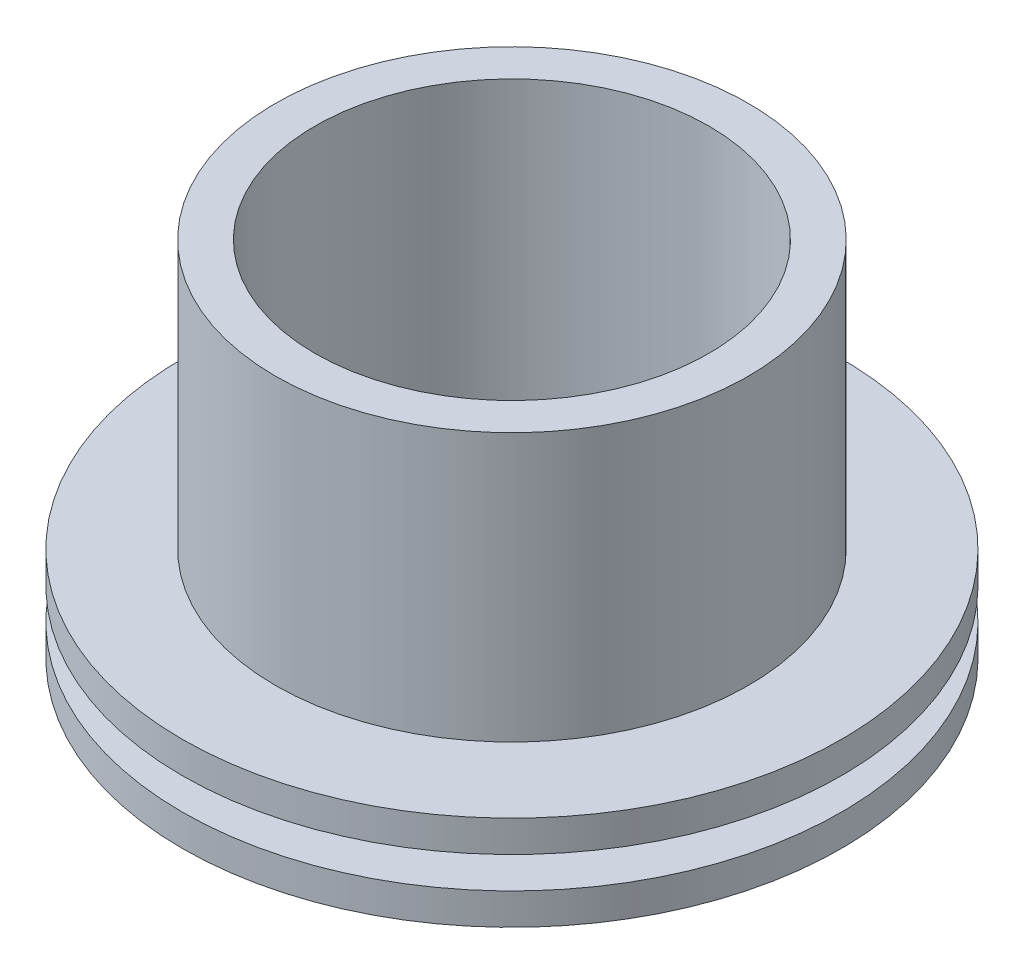
ISO-10303-21;
HEADER;
FILE_DESCRIPTION(('STEP AP214'),'2;1');
FILE_NAME('part.step','',(''),(''),'','','');
FILE_SCHEMA(('AUTOMOTIVE_DESIGN { 1 0 10303 214 1 1 1 1 }'));
ENDSEC;
DATA;
#1=APPLICATION_CONTEXT('core data for automotive mechanical design processes');
#2=APPLICATION_PROTOCOL_DEFINITION('international standard','automotive_design',2000,#1);
#3=PRODUCT_CONTEXT('',#1,'mechanical');
#4=PRODUCT('Part','Part','',(#3));
#5=PRODUCT_RELATED_PRODUCT_CATEGORY('part','',(#4));
#6=PRODUCT_DEFINITION_FORMATION('','',#4);
#7=PRODUCT_DEFINITION_CONTEXT('part definition',#1,'design');
#8=PRODUCT_DEFINITION('design','',#6,#7);
#9=PRODUCT_DEFINITION_SHAPE('','',#8);
#10=(LENGTH_UNIT() NAMED_UNIT(*) SI_UNIT(.MILLI.,.METRE.));
#11=(NAMED_UNIT(*) PLANE_ANGLE_UNIT() SI_UNIT($,.RADIAN.));
#12=(NAMED_UNIT(*) SI_UNIT($,.STERADIAN.) SOLID_ANGLE_UNIT());
#13=UNCERTAINTY_MEASURE_WITH_UNIT(LENGTH_MEASURE(1.E-05),#10,'distance_accuracy_value','');
#14=(GEOMETRIC_REPRESENTATION_CONTEXT(3) GLOBAL_UNCERTAINTY_ASSIGNED_CONTEXT((#13)) GLOBAL_UNIT_ASSIGNED_CONTEXT((#10,
#11,#12)) REPRESENTATION_CONTEXT('',''));
#15=CARTESIAN_POINT('',(0.,0.,0.));
#16=DIRECTION('',(0.,0.,1.));
#17=DIRECTION('',(1.,0.,0.));
#18=AXIS2_PLACEMENT_3D('',#15,#16,#17);
#19=CARTESIAN_POINT('',(0.,-6.,0.));
#20=DIRECTION('',(0.,1.,0.));
#21=DIRECTION('',(0.,0.,1.));
#22=AXIS2_PLACEMENT_3D('',#19,#20,#21);
#23=CYLINDRICAL_SURFACE('',#22,20.9134309357097);
#24=CARTESIAN_POINT('',(0.,-6.,0.));
#25=DIRECTION('',(0.,1.,0.));
#26=DIRECTION('',(0.,0.,1.));
#27=AXIS2_PLACEMENT_3D('',#24,#25,#26);
#28=CIRCLE('',#27,20.9134309357097);
#29=CARTESIAN_POINT('',(0.,-6.,20.9134309357097));
#30=VERTEX_POINT('',#29);
#31=EDGE_CURVE('E54',#30,#30,#28,.T.);
#32=ORIENTED_EDGE('',*,*,#31,.T.);
#33=EDGE_LOOP('',(#32));
#34=FACE_BOUND('',#33,.T.);
#35=CARTESIAN_POINT('',(0.,-4.,0.));
#36=DIRECTION('',(0.,1.,0.));
#37=DIRECTION('',(0.,0.,1.));
#38=AXIS2_PLACEMENT_3D('',#35,#36,#37);
#39=CIRCLE('',#38,20.9134309357097);
#40=CARTESIAN_POINT('',(0.,-4.,20.9134309357097));
#41=VERTEX_POINT('',#40);
#42=EDGE_CURVE('E55',#41,#41,#39,.T.);
#43=ORIENTED_EDGE('',*,*,#42,.F.);
#44=EDGE_LOOP('',(#43));
#45=FACE_BOUND('',#44,.T.);
#46=ADVANCED_FACE('F33',(#34,#45),#23,.T.);
#47=CARTESIAN_POINT('',(0.,17.,0.));
#48=DIRECTION('',(0.,-1.,0.));
#49=DIRECTION('',(0.,0.,-1.));
#50=AXIS2_PLACEMENT_3D('',#47,#48,#49);
#51=CYLINDRICAL_SURFACE('',#50,12.5);
#52=CARTESIAN_POINT('',(0.,17.,0.));
#53=DIRECTION('',(0.,1.,0.));
#54=DIRECTION('',(0.,0.,1.));
#55=AXIS2_PLACEMENT_3D('',#52,#53,#54);
#56=CIRCLE('',#55,12.5);
#57=CARTESIAN_POINT('',(0.,17.,12.5));
#58=VERTEX_POINT('',#57);
#59=EDGE_CURVE('E40',#58,#58,#56,.T.);
#60=ORIENTED_EDGE('',*,*,#59,.T.);
#61=EDGE_LOOP('',(#60));
#62=FACE_BOUND('',#61,.T.);
#63=CARTESIAN_POINT('',(0.,-6.,0.));
#64=DIRECTION('',(0.,1.,0.));
#65=DIRECTION('',(0.,0.,1.));
#66=AXIS2_PLACEMENT_3D('',#63,#64,#65);
#67=CIRCLE('',#66,12.5);
#68=CARTESIAN_POINT('',(0.,-6.,12.5));
#69=VERTEX_POINT('',#68);
#70=EDGE_CURVE('E48',#69,#69,#67,.T.);
#71=ORIENTED_EDGE('',*,*,#70,.F.);
#72=EDGE_LOOP('',(#71));
#73=FACE_BOUND('',#72,.T.);
#74=ADVANCED_FACE('F35',(#62,#73),#51,.F.);
#75=CARTESIAN_POINT('',(0.,17.,0.));
#76=DIRECTION('',(0.,-1.,0.));
#77=DIRECTION('',(0.,0.,-1.));
#78=AXIS2_PLACEMENT_3D('',#75,#76,#77);
#79=CYLINDRICAL_SURFACE('',#78,15.);
#80=CARTESIAN_POINT('',(0.,17.,0.));
#81=DIRECTION('',(0.,1.,0.));
#82=DIRECTION('',(0.,0.,1.));
#83=AXIS2_PLACEMENT_3D('',#80,#81,#82);
#84=CIRCLE('',#83,15.);
#85=CARTESIAN_POINT('',(0.,17.,15.));
#86=VERTEX_POINT('',#85);
#87=EDGE_CURVE('E10',#86,#86,#84,.T.);
#88=ORIENTED_EDGE('',*,*,#87,.F.);
#89=EDGE_LOOP('',(#88));
#90=FACE_BOUND('',#89,.T.);
#91=CARTESIAN_POINT('',(0.,0.,0.));
#92=DIRECTION('',(0.,1.,0.));
#93=DIRECTION('',(0.,0.,1.));
#94=AXIS2_PLACEMENT_3D('',#91,#92,#93);
#95=CIRCLE('',#94,15.);
#96=CARTESIAN_POINT('',(0.,0.,15.));
#97=VERTEX_POINT('',#96);
#98=EDGE_CURVE('E44',#97,#97,#95,.T.);
#99=ORIENTED_EDGE('',*,*,#98,.T.);
#100=EDGE_LOOP('',(#99));
#101=FACE_BOUND('',#100,.T.);
#102=ADVANCED_FACE('F89',(#90,#101),#79,.T.);
#103=CARTESIAN_POINT('',(0.,17.,0.));
#104=DIRECTION('',(0.,1.,0.));
#105=DIRECTION('',(0.,0.,1.));
#106=AXIS2_PLACEMENT_3D('',#103,#104,#105);
#107=PLANE('',#106);
#108=ORIENTED_EDGE('',*,*,#59,.F.);
#109=EDGE_LOOP('',(#108));
#110=FACE_BOUND('',#109,.T.);
#111=ORIENTED_EDGE('',*,*,#87,.T.);
#112=EDGE_LOOP('',(#111));
#113=FACE_BOUND('',#112,.T.);
#114=ADVANCED_FACE('F94',(#110,#113),#107,.T.);
#115=CARTESIAN_POINT('',(0.,-2.,0.));
#116=DIRECTION('',(0.,1.,0.));
#117=DIRECTION('',(0.,0.,1.));
#118=AXIS2_PLACEMENT_3D('',#115,#116,#117);
#119=CIRCLE('',#118,20.9134309357097);
#120=CARTESIAN_POINT('',(0.,-2.,20.9134309357097));
#121=VERTEX_POINT('',#120);
#122=EDGE_CURVE('E60',#121,#121,#119,.T.);
#123=ORIENTED_EDGE('',*,*,#122,.T.);
#124=EDGE_LOOP('',(#123));
#125=FACE_BOUND('',#124,.T.);
#126=CARTESIAN_POINT('',(0.,0.,0.));
#127=DIRECTION('',(0.,1.,0.));
#128=DIRECTION('',(0.,0.,1.));
#129=AXIS2_PLACEMENT_3D('',#126,#127,#128);
#130=CIRCLE('',#129,20.9134309357097);
#131=CARTESIAN_POINT('',(0.,0.,20.9134309357097));
#132=VERTEX_POINT('',#131);
#133=EDGE_CURVE('E51',#132,#132,#130,.T.);
#134=ORIENTED_EDGE('',*,*,#133,.F.);
#135=EDGE_LOOP('',(#134));
#136=FACE_BOUND('',#135,.T.);
#137=ADVANCED_FACE('F85',(#125,#136),#23,.T.);
#138=CARTESIAN_POINT('',(0.,-6.,0.));
#139=DIRECTION('',(0.,1.,0.));
#140=DIRECTION('',(0.,0.,1.));
#141=AXIS2_PLACEMENT_3D('',#138,#139,#140);
#142=PLANE('',#141);
#143=ORIENTED_EDGE('',*,*,#31,.F.);
#144=EDGE_LOOP('',(#143));
#145=FACE_BOUND('',#144,.T.);
#146=ORIENTED_EDGE('',*,*,#70,.T.);
#147=EDGE_LOOP('',(#146));
#148=FACE_BOUND('',#147,.T.);
#149=ADVANCED_FACE('F93',(#145,#148),#142,.F.);
#150=CARTESIAN_POINT('',(0.,0.,0.));
#151=DIRECTION('',(0.,1.,0.));
#152=DIRECTION('',(0.,0.,1.));
#153=AXIS2_PLACEMENT_3D('',#150,#151,#152);
#154=PLANE('',#153);
#155=ORIENTED_EDGE('',*,*,#98,.F.);
#156=EDGE_LOOP('',(#155));
#157=FACE_BOUND('',#156,.T.);
#158=ORIENTED_EDGE('',*,*,#133,.T.);
#159=EDGE_LOOP('',(#158));
#160=FACE_BOUND('',#159,.T.);
#161=ADVANCED_FACE('F100',(#157,#160),#154,.T.);
#162=CARTESIAN_POINT('',(0.,-4.,0.));
#163=DIRECTION('',(0.,1.,0.));
#164=DIRECTION('',(0.,0.,1.));
#165=AXIS2_PLACEMENT_3D('',#162,#163,#164);
#166=CYLINDRICAL_SURFACE('',#165,15.9134309357097);
#167=CARTESIAN_POINT('',(0.,-4.,0.));
#168=DIRECTION('',(0.,1.,0.));
#169=DIRECTION('',(0.,0.,1.));
#170=AXIS2_PLACEMENT_3D('',#167,#168,#169);
#171=CIRCLE('',#170,15.9134309357097);
#172=CARTESIAN_POINT('',(0.,-4.,15.9134309357097));
#173=VERTEX_POINT('',#172);
#174=EDGE_CURVE('E63',#173,#173,#171,.T.);
#175=ORIENTED_EDGE('',*,*,#174,.T.);
#176=EDGE_LOOP('',(#175));
#177=FACE_BOUND('',#176,.T.);
#178=CARTESIAN_POINT('',(0.,-2.,0.));
#179=DIRECTION('',(0.,1.,0.));
#180=DIRECTION('',(0.,0.,1.));
#181=AXIS2_PLACEMENT_3D('',#178,#179,#180);
#182=CIRCLE('',#181,15.9134309357097);
#183=CARTESIAN_POINT('',(0.,-2.,15.9134309357097));
#184=VERTEX_POINT('',#183);
#185=EDGE_CURVE('E64',#184,#184,#182,.T.);
#186=ORIENTED_EDGE('',*,*,#185,.F.);
#187=EDGE_LOOP('',(#186));
#188=FACE_BOUND('',#187,.T.);
#189=ADVANCED_FACE('F72',(#177,#188),#166,.T.);
#190=CARTESIAN_POINT('',(0.,-4.,0.));
#191=DIRECTION('',(0.,1.,0.));
#192=DIRECTION('',(0.,0.,1.));
#193=AXIS2_PLACEMENT_3D('',#190,#191,#192);
#194=PLANE('',#193);
#195=ORIENTED_EDGE('',*,*,#174,.F.);
#196=EDGE_LOOP('',(#195));
#197=FACE_BOUND('',#196,.T.);
#198=ORIENTED_EDGE('',*,*,#42,.T.);
#199=EDGE_LOOP('',(#198));
#200=FACE_BOUND('',#199,.T.);
#201=ADVANCED_FACE('F75',(#197,#200),#194,.T.);
#202=CARTESIAN_POINT('',(0.,-2.,0.));
#203=DIRECTION('',(0.,1.,0.));
#204=DIRECTION('',(0.,0.,1.));
#205=AXIS2_PLACEMENT_3D('',#202,#203,#204);
#206=PLANE('',#205);
#207=ORIENTED_EDGE('',*,*,#185,.T.);
#208=EDGE_LOOP('',(#207));
#209=FACE_BOUND('',#208,.T.);
#210=ORIENTED_EDGE('',*,*,#122,.F.);
#211=EDGE_LOOP('',(#210));
#212=FACE_BOUND('',#211,.T.);
#213=ADVANCED_FACE('F78',(#209,#212),#206,.F.);
#214=CLOSED_SHELL('',(#46,#74,#102,#114,#137,#149,#161,#189,#201,#213));
#215=MANIFOLD_SOLID_BREP('B2',#214);
#216=ADVANCED_BREP_SHAPE_REPRESENTATION('',(#18,#215),#14);
#217=SHAPE_DEFINITION_REPRESENTATION(#9,#216);
ENDSEC;
END-ISO-10303-21;
